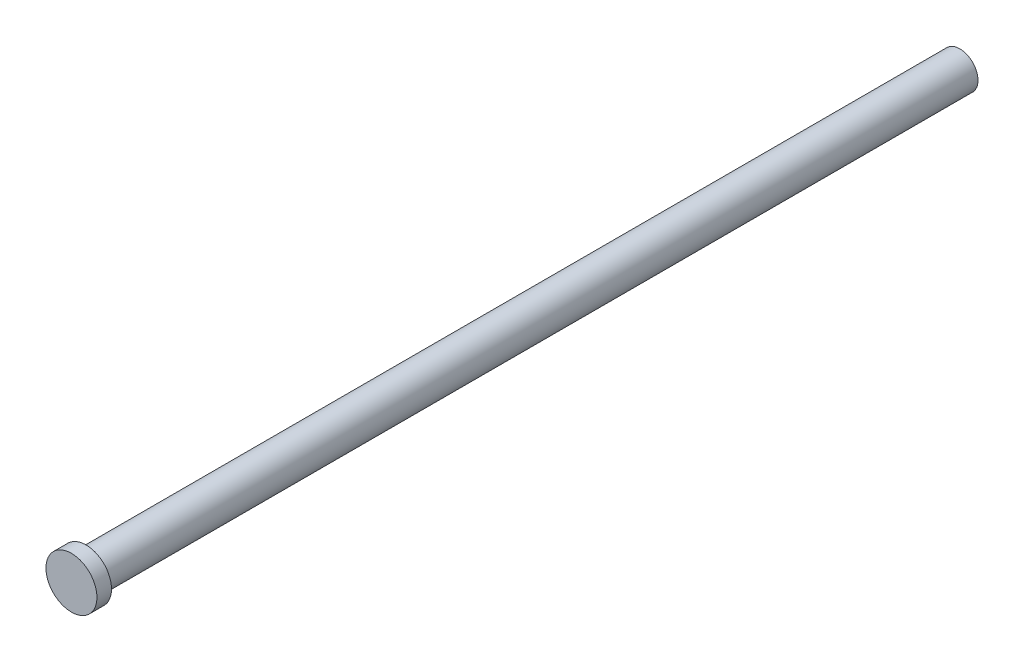
ISO-10303-21;
HEADER;
FILE_DESCRIPTION(('STEP AP214'),'2;1');
FILE_NAME('part.step','',(''),(''),'','','');
FILE_SCHEMA(('AUTOMOTIVE_DESIGN { 1 0 10303 214 1 1 1 1 }'));
ENDSEC;
DATA;
#1=APPLICATION_CONTEXT('core data for automotive mechanical design processes');
#2=APPLICATION_PROTOCOL_DEFINITION('international standard','automotive_design',2000,#1);
#3=PRODUCT_CONTEXT('',#1,'mechanical');
#4=PRODUCT('Part','Part','',(#3));
#5=PRODUCT_RELATED_PRODUCT_CATEGORY('part','',(#4));
#6=PRODUCT_DEFINITION_FORMATION('','',#4);
#7=PRODUCT_DEFINITION_CONTEXT('part definition',#1,'design');
#8=PRODUCT_DEFINITION('design','',#6,#7);
#9=PRODUCT_DEFINITION_SHAPE('','',#8);
#10=(LENGTH_UNIT() NAMED_UNIT(*) SI_UNIT(.MILLI.,.METRE.));
#11=(NAMED_UNIT(*) PLANE_ANGLE_UNIT() SI_UNIT($,.RADIAN.));
#12=(NAMED_UNIT(*) SI_UNIT($,.STERADIAN.) SOLID_ANGLE_UNIT());
#13=UNCERTAINTY_MEASURE_WITH_UNIT(LENGTH_MEASURE(1.E-05),#10,'distance_accuracy_value','');
#14=(GEOMETRIC_REPRESENTATION_CONTEXT(3) GLOBAL_UNCERTAINTY_ASSIGNED_CONTEXT((#13)) GLOBAL_UNIT_ASSIGNED_CONTEXT((#10,
#11,#12)) REPRESENTATION_CONTEXT('',''));
#15=CARTESIAN_POINT('',(0.,0.,0.));
#16=DIRECTION('',(0.,0.,1.));
#17=DIRECTION('',(1.,0.,0.));
#18=AXIS2_PLACEMENT_3D('',#15,#16,#17);
#19=CARTESIAN_POINT('',(0.,0.,600.));
#20=DIRECTION('',(0.,0.,-1.));
#21=DIRECTION('',(-1.,0.,0.));
#22=AXIS2_PLACEMENT_3D('',#19,#20,#21);
#23=CYLINDRICAL_SURFACE('',#22,12.5);
#24=CARTESIAN_POINT('',(0.,0.,600.));
#25=DIRECTION('',(0.,0.,1.));
#26=DIRECTION('',(1.,0.,0.));
#27=AXIS2_PLACEMENT_3D('',#24,#25,#26);
#28=CIRCLE('',#27,12.5);
#29=CARTESIAN_POINT('',(12.5,0.,600.));
#30=VERTEX_POINT('',#29);
#31=EDGE_CURVE('E10',#30,#30,#28,.T.);
#32=ORIENTED_EDGE('',*,*,#31,.F.);
#33=EDGE_LOOP('',(#32));
#34=FACE_BOUND('',#33,.T.);
#35=CARTESIAN_POINT('',(0.,0.,0.));
#36=DIRECTION('',(0.,0.,1.));
#37=DIRECTION('',(1.,0.,0.));
#38=AXIS2_PLACEMENT_3D('',#35,#36,#37);
#39=CIRCLE('',#38,12.5);
#40=CARTESIAN_POINT('',(12.5,0.,0.));
#41=VERTEX_POINT('',#40);
#42=EDGE_CURVE('E34',#41,#41,#39,.T.);
#43=ORIENTED_EDGE('',*,*,#42,.T.);
#44=EDGE_LOOP('',(#43));
#45=FACE_BOUND('',#44,.T.);
#46=ADVANCED_FACE('F31',(#34,#45),#23,.T.);
#47=CARTESIAN_POINT('',(0.,0.,0.));
#48=DIRECTION('',(0.,0.,1.));
#49=DIRECTION('',(1.,0.,0.));
#50=AXIS2_PLACEMENT_3D('',#47,#48,#49);
#51=PLANE('',#50);
#52=ORIENTED_EDGE('',*,*,#42,.F.);
#53=EDGE_LOOP('',(#52));
#54=FACE_BOUND('',#53,.T.);
#55=ADVANCED_FACE('F54',(#54),#51,.F.);
#56=CARTESIAN_POINT('',(0.,0.,610.));
#57=DIRECTION('',(0.,0.,-1.));
#58=DIRECTION('',(-1.,0.,0.));
#59=AXIS2_PLACEMENT_3D('',#56,#57,#58);
#60=CYLINDRICAL_SURFACE('',#59,17.5);
#61=CARTESIAN_POINT('',(0.,0.,610.));
#62=DIRECTION('',(0.,0.,1.));
#63=DIRECTION('',(1.,0.,0.));
#64=AXIS2_PLACEMENT_3D('',#61,#62,#63);
#65=CIRCLE('',#64,17.5);
#66=CARTESIAN_POINT('',(17.5,0.,610.));
#67=VERTEX_POINT('',#66);
#68=EDGE_CURVE('E41',#67,#67,#65,.T.);
#69=ORIENTED_EDGE('',*,*,#68,.F.);
#70=EDGE_LOOP('',(#69));
#71=FACE_BOUND('',#70,.T.);
#72=CARTESIAN_POINT('',(0.,0.,600.));
#73=DIRECTION('',(0.,0.,1.));
#74=DIRECTION('',(1.,0.,0.));
#75=AXIS2_PLACEMENT_3D('',#72,#73,#74);
#76=CIRCLE('',#75,17.5);
#77=CARTESIAN_POINT('',(17.5,0.,600.));
#78=VERTEX_POINT('',#77);
#79=EDGE_CURVE('E43',#78,#78,#76,.T.);
#80=ORIENTED_EDGE('',*,*,#79,.T.);
#81=EDGE_LOOP('',(#80));
#82=FACE_BOUND('',#81,.T.);
#83=ADVANCED_FACE('F51',(#71,#82),#60,.T.);
#84=CARTESIAN_POINT('',(0.,0.,610.));
#85=DIRECTION('',(0.,0.,1.));
#86=DIRECTION('',(1.,0.,0.));
#87=AXIS2_PLACEMENT_3D('',#84,#85,#86);
#88=PLANE('',#87);
#89=ORIENTED_EDGE('',*,*,#68,.T.);
#90=EDGE_LOOP('',(#89));
#91=FACE_BOUND('',#90,.T.);
#92=ADVANCED_FACE('F49',(#91),#88,.T.);
#93=CARTESIAN_POINT('',(0.,0.,600.));
#94=DIRECTION('',(0.,0.,1.));
#95=DIRECTION('',(1.,0.,0.));
#96=AXIS2_PLACEMENT_3D('',#93,#94,#95);
#97=PLANE('',#96);
#98=ORIENTED_EDGE('',*,*,#31,.T.);
#99=EDGE_LOOP('',(#98));
#100=FACE_BOUND('',#99,.T.);
#101=ORIENTED_EDGE('',*,*,#79,.F.);
#102=EDGE_LOOP('',(#101));
#103=FACE_BOUND('',#102,.T.);
#104=ADVANCED_FACE('F58',(#100,#103),#97,.F.);
#105=CLOSED_SHELL('',(#46,#55,#83,#92,#104));
#106=MANIFOLD_SOLID_BREP('B2',#105);
#107=ADVANCED_BREP_SHAPE_REPRESENTATION('',(#18,#106),#14);
#108=SHAPE_DEFINITION_REPRESENTATION(#9,#107);
ENDSEC;
END-ISO-10303-21;
